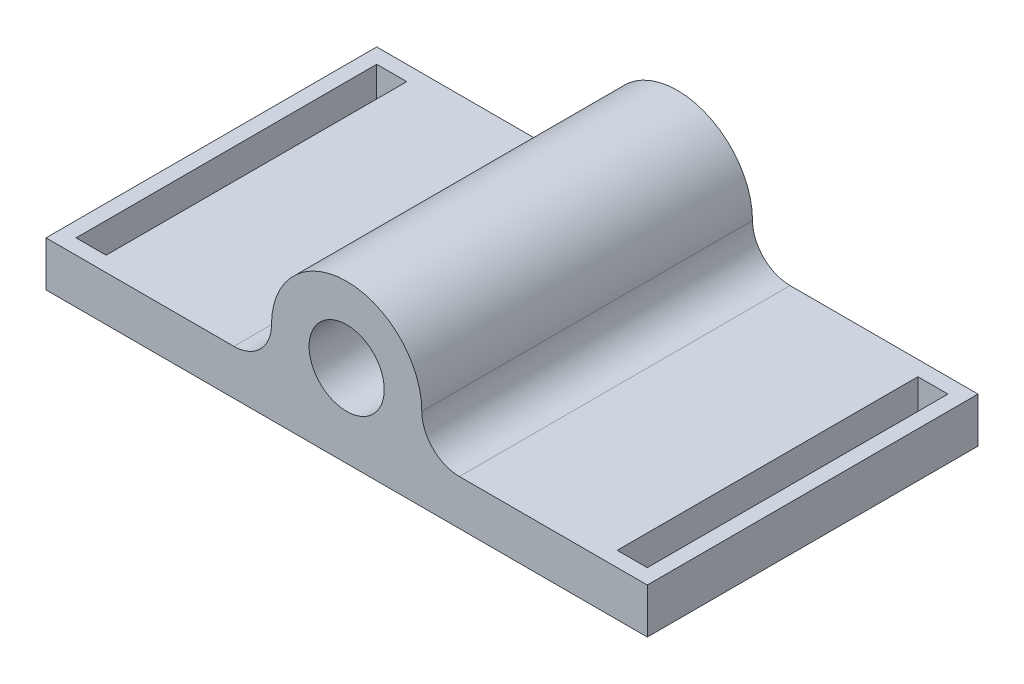
ISO-10303-21;
HEADER;
FILE_DESCRIPTION(('STEP AP214'),'2;1');
FILE_NAME('part.step','',(''),(''),'','','');
FILE_SCHEMA(('AUTOMOTIVE_DESIGN { 1 0 10303 214 1 1 1 1 }'));
ENDSEC;
DATA;
#1=APPLICATION_CONTEXT('core data for automotive mechanical design processes');
#2=APPLICATION_PROTOCOL_DEFINITION('international standard','automotive_design',2000,#1);
#3=PRODUCT_CONTEXT('',#1,'mechanical');
#4=PRODUCT('Part','Part','',(#3));
#5=PRODUCT_RELATED_PRODUCT_CATEGORY('part','',(#4));
#6=PRODUCT_DEFINITION_FORMATION('','',#4);
#7=PRODUCT_DEFINITION_CONTEXT('part definition',#1,'design');
#8=PRODUCT_DEFINITION('design','',#6,#7);
#9=PRODUCT_DEFINITION_SHAPE('','',#8);
#10=(LENGTH_UNIT() NAMED_UNIT(*) SI_UNIT(.MILLI.,.METRE.));
#11=(NAMED_UNIT(*) PLANE_ANGLE_UNIT() SI_UNIT($,.RADIAN.));
#12=(NAMED_UNIT(*) SI_UNIT($,.STERADIAN.) SOLID_ANGLE_UNIT());
#13=UNCERTAINTY_MEASURE_WITH_UNIT(LENGTH_MEASURE(1.E-05),#10,'distance_accuracy_value','');
#14=(GEOMETRIC_REPRESENTATION_CONTEXT(3) GLOBAL_UNCERTAINTY_ASSIGNED_CONTEXT((#13)) GLOBAL_UNIT_ASSIGNED_CONTEXT((#10,
#11,#12)) REPRESENTATION_CONTEXT('',''));
#15=CARTESIAN_POINT('',(0.,0.,0.));
#16=DIRECTION('',(0.,0.,1.));
#17=DIRECTION('',(1.,0.,0.));
#18=AXIS2_PLACEMENT_3D('',#15,#16,#17);
#19=CARTESIAN_POINT('',(-15.,10.1307131936962,22.));
#20=DIRECTION('',(0.,0.,1.));
#21=DIRECTION('',(1.,0.,0.));
#22=AXIS2_PLACEMENT_3D('',#19,#20,#21);
#23=PLANE('',#22);
#24=DIRECTION('',(0.,-1.,0.));
#25=VECTOR('',#24,1.);
#26=CARTESIAN_POINT('',(-27.5,4.63071319369619,22.));
#27=LINE('',#26,#25);
#28=CARTESIAN_POINT('',(-27.5,7.63071319369619,22.));
#29=VERTEX_POINT('',#28);
#30=CARTESIAN_POINT('',(-27.5,4.63071319369619,22.));
#31=VERTEX_POINT('',#30);
#32=EDGE_CURVE('E258',#29,#31,#27,.T.);
#33=ORIENTED_EDGE('',*,*,#32,.T.);
#34=DIRECTION('',(1.,0.,0.));
#35=VECTOR('',#34,1.);
#36=CARTESIAN_POINT('',(-27.5,4.63071319369619,22.));
#37=LINE('',#36,#35);
#38=CARTESIAN_POINT('',(12.5,4.63071319369619,22.));
#39=VERTEX_POINT('',#38);
#40=EDGE_CURVE('E262',#31,#39,#37,.T.);
#41=ORIENTED_EDGE('',*,*,#40,.T.);
#42=DIRECTION('',(0.,1.,0.));
#43=VECTOR('',#42,1.);
#44=CARTESIAN_POINT('',(12.5,4.63071319369619,22.));
#45=LINE('',#44,#43);
#46=CARTESIAN_POINT('',(12.5,7.63071319369619,22.));
#47=VERTEX_POINT('',#46);
#48=EDGE_CURVE('E266',#39,#47,#45,.T.);
#49=ORIENTED_EDGE('',*,*,#48,.T.);
#50=DIRECTION('',(-1.,0.,0.));
#51=VECTOR('',#50,1.);
#52=CARTESIAN_POINT('',(12.5,7.63071319369619,22.));
#53=LINE('',#52,#51);
#54=CARTESIAN_POINT('',(0.,7.63071319369619,22.));
#55=VERTEX_POINT('',#54);
#56=EDGE_CURVE('E269',#47,#55,#53,.T.);
#57=ORIENTED_EDGE('',*,*,#56,.T.);
#58=CARTESIAN_POINT('',(0.,10.1307131936962,22.));
#59=DIRECTION('',(0.,0.,-1.));
#60=DIRECTION('',(-1.,0.,0.));
#61=AXIS2_PLACEMENT_3D('',#58,#59,#60);
#62=CIRCLE('',#61,2.5);
#63=CARTESIAN_POINT('',(-2.5,10.1307131936962,22.));
#64=VERTEX_POINT('',#63);
#65=EDGE_CURVE('E272',#55,#64,#62,.T.);
#66=ORIENTED_EDGE('',*,*,#65,.T.);
#67=CARTESIAN_POINT('',(-7.5,10.1307131936962,22.));
#68=DIRECTION('',(0.,0.,1.));
#69=DIRECTION('',(1.,0.,0.));
#70=AXIS2_PLACEMENT_3D('',#67,#68,#69);
#71=CIRCLE('',#70,5.);
#72=CARTESIAN_POINT('',(-12.5,10.1307131936962,22.));
#73=VERTEX_POINT('',#72);
#74=EDGE_CURVE('E275',#64,#73,#71,.T.);
#75=ORIENTED_EDGE('',*,*,#74,.T.);
#76=CARTESIAN_POINT('',(-15.,10.1307131936962,22.));
#77=DIRECTION('',(0.,0.,-1.));
#78=DIRECTION('',(1.,0.,0.));
#79=AXIS2_PLACEMENT_3D('',#76,#77,#78);
#80=CIRCLE('',#79,2.5);
#81=CARTESIAN_POINT('',(-15.,7.63071319369619,22.));
#82=VERTEX_POINT('',#81);
#83=EDGE_CURVE('E278',#73,#82,#80,.T.);
#84=ORIENTED_EDGE('',*,*,#83,.T.);
#85=DIRECTION('',(-1.,0.,0.));
#86=VECTOR('',#85,1.);
#87=CARTESIAN_POINT('',(-27.5,7.63071319369619,22.));
#88=LINE('',#87,#86);
#89=EDGE_CURVE('E281',#82,#29,#88,.T.);
#90=ORIENTED_EDGE('',*,*,#89,.T.);
#91=EDGE_LOOP('',(#33,#41,#49,#57,#66,#75,#84,#90));
#92=FACE_BOUND('',#91,.T.);
#93=CARTESIAN_POINT('',(-7.5,10.1307131936962,22.));
#94=DIRECTION('',(0.,0.,1.));
#95=DIRECTION('',(1.,0.,0.));
#96=AXIS2_PLACEMENT_3D('',#93,#94,#95);
#97=CIRCLE('',#96,2.5);
#98=CARTESIAN_POINT('',(-5.,10.1307131936962,22.));
#99=VERTEX_POINT('',#98);
#100=EDGE_CURVE('E250',#99,#99,#97,.T.);
#101=ORIENTED_EDGE('',*,*,#100,.F.);
#102=EDGE_LOOP('',(#101));
#103=FACE_BOUND('',#102,.T.);
#104=ADVANCED_FACE('F42',(#92,#103),#23,.T.);
#105=CARTESIAN_POINT('',(-15.,10.1307131936962,0.));
#106=DIRECTION('',(0.,0.,1.));
#107=DIRECTION('',(1.,0.,0.));
#108=AXIS2_PLACEMENT_3D('',#105,#106,#107);
#109=PLANE('',#108);
#110=DIRECTION('',(0.,-1.,0.));
#111=VECTOR('',#110,1.);
#112=CARTESIAN_POINT('',(-27.5,4.63071319369619,0.));
#113=LINE('',#112,#111);
#114=CARTESIAN_POINT('',(-27.5,7.63071319369619,0.));
#115=VERTEX_POINT('',#114);
#116=CARTESIAN_POINT('',(-27.5,4.63071319369619,0.));
#117=VERTEX_POINT('',#116);
#118=EDGE_CURVE('E254',#115,#117,#113,.T.);
#119=ORIENTED_EDGE('',*,*,#118,.F.);
#120=DIRECTION('',(-1.,0.,0.));
#121=VECTOR('',#120,1.);
#122=CARTESIAN_POINT('',(-27.5,7.63071319369619,0.));
#123=LINE('',#122,#121);
#124=CARTESIAN_POINT('',(-15.,7.63071319369619,0.));
#125=VERTEX_POINT('',#124);
#126=EDGE_CURVE('E263',#125,#115,#123,.T.);
#127=ORIENTED_EDGE('',*,*,#126,.F.);
#128=CARTESIAN_POINT('',(-15.,10.1307131936962,0.));
#129=DIRECTION('',(0.,0.,-1.));
#130=DIRECTION('',(1.,0.,0.));
#131=AXIS2_PLACEMENT_3D('',#128,#129,#130);
#132=CIRCLE('',#131,2.5);
#133=CARTESIAN_POINT('',(-12.5,10.1307131936962,0.));
#134=VERTEX_POINT('',#133);
#135=EDGE_CURVE('E303',#134,#125,#132,.T.);
#136=ORIENTED_EDGE('',*,*,#135,.F.);
#137=CARTESIAN_POINT('',(-7.5,10.1307131936962,0.));
#138=DIRECTION('',(0.,0.,1.));
#139=DIRECTION('',(1.,0.,0.));
#140=AXIS2_PLACEMENT_3D('',#137,#138,#139);
#141=CIRCLE('',#140,5.);
#142=CARTESIAN_POINT('',(-2.5,10.1307131936962,0.));
#143=VERTEX_POINT('',#142);
#144=EDGE_CURVE('E300',#143,#134,#141,.T.);
#145=ORIENTED_EDGE('',*,*,#144,.F.);
#146=CARTESIAN_POINT('',(0.,10.1307131936962,0.));
#147=DIRECTION('',(0.,0.,-1.));
#148=DIRECTION('',(-1.,0.,0.));
#149=AXIS2_PLACEMENT_3D('',#146,#147,#148);
#150=CIRCLE('',#149,2.5);
#151=CARTESIAN_POINT('',(0.,7.63071319369619,0.));
#152=VERTEX_POINT('',#151);
#153=EDGE_CURVE('E297',#152,#143,#150,.T.);
#154=ORIENTED_EDGE('',*,*,#153,.F.);
#155=DIRECTION('',(-1.,0.,0.));
#156=VECTOR('',#155,1.);
#157=CARTESIAN_POINT('',(12.5,7.63071319369619,0.));
#158=LINE('',#157,#156);
#159=CARTESIAN_POINT('',(12.5,7.63071319369619,0.));
#160=VERTEX_POINT('',#159);
#161=EDGE_CURVE('E294',#160,#152,#158,.T.);
#162=ORIENTED_EDGE('',*,*,#161,.F.);
#163=DIRECTION('',(0.,1.,0.));
#164=VECTOR('',#163,1.);
#165=CARTESIAN_POINT('',(12.5,4.63071319369619,0.));
#166=LINE('',#165,#164);
#167=CARTESIAN_POINT('',(12.5,4.63071319369619,0.));
#168=VERTEX_POINT('',#167);
#169=EDGE_CURVE('E291',#168,#160,#166,.T.);
#170=ORIENTED_EDGE('',*,*,#169,.F.);
#171=DIRECTION('',(1.,0.,0.));
#172=VECTOR('',#171,1.);
#173=CARTESIAN_POINT('',(-27.5,4.63071319369619,0.));
#174=LINE('',#173,#172);
#175=EDGE_CURVE('E288',#117,#168,#174,.T.);
#176=ORIENTED_EDGE('',*,*,#175,.F.);
#177=EDGE_LOOP('',(#119,#127,#136,#145,#154,#162,#170,#176));
#178=FACE_BOUND('',#177,.T.);
#179=CARTESIAN_POINT('',(-7.5,10.1307131936962,0.));
#180=DIRECTION('',(0.,0.,1.));
#181=DIRECTION('',(1.,0.,0.));
#182=AXIS2_PLACEMENT_3D('',#179,#180,#181);
#183=CIRCLE('',#182,2.5);
#184=CARTESIAN_POINT('',(-5.,10.1307131936962,0.));
#185=VERTEX_POINT('',#184);
#186=EDGE_CURVE('E249',#185,#185,#183,.T.);
#187=ORIENTED_EDGE('',*,*,#186,.T.);
#188=EDGE_LOOP('',(#187));
#189=FACE_BOUND('',#188,.T.);
#190=ADVANCED_FACE('F342',(#178,#189),#109,.F.);
#191=CARTESIAN_POINT('',(-27.5,4.63071319369619,22.));
#192=DIRECTION('',(1.,0.,0.));
#193=DIRECTION('',(0.,0.,-1.));
#194=AXIS2_PLACEMENT_3D('',#191,#192,#193);
#195=PLANE('',#194);
#196=ORIENTED_EDGE('',*,*,#118,.T.);
#197=DIRECTION('',(0.,0.,-1.));
#198=VECTOR('',#197,1.);
#199=CARTESIAN_POINT('',(-27.5,4.63071319369619,22.));
#200=LINE('',#199,#198);
#201=EDGE_CURVE('E11',#31,#117,#200,.T.);
#202=ORIENTED_EDGE('',*,*,#201,.F.);
#203=ORIENTED_EDGE('',*,*,#32,.F.);
#204=DIRECTION('',(0.,0.,-1.));
#205=VECTOR('',#204,1.);
#206=CARTESIAN_POINT('',(-27.5,7.63071319369619,22.));
#207=LINE('',#206,#205);
#208=EDGE_CURVE('E284',#29,#115,#207,.T.);
#209=ORIENTED_EDGE('',*,*,#208,.T.);
#210=EDGE_LOOP('',(#196,#202,#203,#209));
#211=FACE_BOUND('',#210,.T.);
#212=ADVANCED_FACE('F44',(#211),#195,.F.);
#213=CARTESIAN_POINT('',(-27.5,4.63071319369619,22.));
#214=DIRECTION('',(0.,1.,0.));
#215=DIRECTION('',(0.,0.,1.));
#216=AXIS2_PLACEMENT_3D('',#213,#214,#215);
#217=PLANE('',#216);
#218=DIRECTION('',(-1.,0.,0.));
#219=VECTOR('',#218,1.);
#220=CARTESIAN_POINT('',(-27.5,4.63071319369619,1.));
#221=LINE('',#220,#219);
#222=CARTESIAN_POINT('',(-24.5,4.63071319369619,1.));
#223=VERTEX_POINT('',#222);
#224=CARTESIAN_POINT('',(-26.5,4.63071319369619,1.));
#225=VERTEX_POINT('',#224);
#226=EDGE_CURVE('E225',#223,#225,#221,.T.);
#227=ORIENTED_EDGE('',*,*,#226,.T.);
#228=DIRECTION('',(0.,0.,1.));
#229=VECTOR('',#228,1.);
#230=CARTESIAN_POINT('',(-26.5,4.63071319369619,22.));
#231=LINE('',#230,#229);
#232=CARTESIAN_POINT('',(-26.5,4.63071319369619,21.));
#233=VERTEX_POINT('',#232);
#234=EDGE_CURVE('E229',#225,#233,#231,.T.);
#235=ORIENTED_EDGE('',*,*,#234,.T.);
#236=DIRECTION('',(1.,0.,0.));
#237=VECTOR('',#236,1.);
#238=CARTESIAN_POINT('',(-27.5,4.63071319369619,21.));
#239=LINE('',#238,#237);
#240=CARTESIAN_POINT('',(-24.5,4.63071319369619,21.));
#241=VERTEX_POINT('',#240);
#242=EDGE_CURVE('E190',#233,#241,#239,.T.);
#243=ORIENTED_EDGE('',*,*,#242,.T.);
#244=DIRECTION('',(0.,0.,-1.));
#245=VECTOR('',#244,1.);
#246=CARTESIAN_POINT('',(-24.5,4.63071319369619,22.));
#247=LINE('',#246,#245);
#248=EDGE_CURVE('E161',#241,#223,#247,.T.);
#249=ORIENTED_EDGE('',*,*,#248,.T.);
#250=EDGE_LOOP('',(#227,#235,#243,#249));
#251=FACE_BOUND('',#250,.T.);
#252=DIRECTION('',(-1.,0.,0.));
#253=VECTOR('',#252,1.);
#254=CARTESIAN_POINT('',(-27.5,4.63071319369619,1.));
#255=LINE('',#254,#253);
#256=CARTESIAN_POINT('',(11.5,4.63071319369619,1.));
#257=VERTEX_POINT('',#256);
#258=CARTESIAN_POINT('',(9.50000000000001,4.63071319369619,1.));
#259=VERTEX_POINT('',#258);
#260=EDGE_CURVE('E241',#257,#259,#255,.T.);
#261=ORIENTED_EDGE('',*,*,#260,.T.);
#262=DIRECTION('',(0.,0.,1.));
#263=VECTOR('',#262,1.);
#264=CARTESIAN_POINT('',(9.50000000000001,4.63071319369619,22.));
#265=LINE('',#264,#263);
#266=CARTESIAN_POINT('',(9.50000000000001,4.63071319369619,21.));
#267=VERTEX_POINT('',#266);
#268=EDGE_CURVE('E245',#259,#267,#265,.T.);
#269=ORIENTED_EDGE('',*,*,#268,.T.);
#270=DIRECTION('',(1.,0.,0.));
#271=VECTOR('',#270,1.);
#272=CARTESIAN_POINT('',(-27.5,4.63071319369619,21.));
#273=LINE('',#272,#271);
#274=CARTESIAN_POINT('',(11.5,4.63071319369619,21.));
#275=VERTEX_POINT('',#274);
#276=EDGE_CURVE('E233',#267,#275,#273,.T.);
#277=ORIENTED_EDGE('',*,*,#276,.T.);
#278=DIRECTION('',(0.,0.,-1.));
#279=VECTOR('',#278,1.);
#280=CARTESIAN_POINT('',(11.5,4.63071319369619,22.));
#281=LINE('',#280,#279);
#282=EDGE_CURVE('E237',#275,#257,#281,.T.);
#283=ORIENTED_EDGE('',*,*,#282,.T.);
#284=EDGE_LOOP('',(#261,#269,#277,#283));
#285=FACE_BOUND('',#284,.T.);
#286=ORIENTED_EDGE('',*,*,#175,.T.);
#287=DIRECTION('',(0.,0.,-1.));
#288=VECTOR('',#287,1.);
#289=CARTESIAN_POINT('',(12.5,4.63071319369619,22.));
#290=LINE('',#289,#288);
#291=EDGE_CURVE('E51',#39,#168,#290,.T.);
#292=ORIENTED_EDGE('',*,*,#291,.F.);
#293=ORIENTED_EDGE('',*,*,#40,.F.);
#294=ORIENTED_EDGE('',*,*,#201,.T.);
#295=EDGE_LOOP('',(#286,#292,#293,#294));
#296=FACE_BOUND('',#295,.T.);
#297=ADVANCED_FACE('F360',(#251,#285,#296),#217,.F.);
#298=CARTESIAN_POINT('',(12.5,4.63071319369619,22.));
#299=DIRECTION('',(-1.,0.,0.));
#300=DIRECTION('',(0.,0.,1.));
#301=AXIS2_PLACEMENT_3D('',#298,#299,#300);
#302=PLANE('',#301);
#303=ORIENTED_EDGE('',*,*,#169,.T.);
#304=DIRECTION('',(0.,0.,-1.));
#305=VECTOR('',#304,1.);
#306=CARTESIAN_POINT('',(12.5,7.63071319369619,22.));
#307=LINE('',#306,#305);
#308=EDGE_CURVE('E327',#47,#160,#307,.T.);
#309=ORIENTED_EDGE('',*,*,#308,.F.);
#310=ORIENTED_EDGE('',*,*,#48,.F.);
#311=ORIENTED_EDGE('',*,*,#291,.T.);
#312=EDGE_LOOP('',(#303,#309,#310,#311));
#313=FACE_BOUND('',#312,.T.);
#314=ADVANCED_FACE('F336',(#313),#302,.F.);
#315=CARTESIAN_POINT('',(12.5,7.63071319369619,22.));
#316=DIRECTION('',(0.,-1.,0.));
#317=DIRECTION('',(0.,0.,-1.));
#318=AXIS2_PLACEMENT_3D('',#315,#316,#317);
#319=PLANE('',#318);
#320=DIRECTION('',(1.,0.,0.));
#321=VECTOR('',#320,1.);
#322=CARTESIAN_POINT('',(9.50000000000001,7.63071319369619,21.));
#323=LINE('',#322,#321);
#324=CARTESIAN_POINT('',(9.50000000000001,7.63071319369619,21.));
#325=VERTEX_POINT('',#324);
#326=CARTESIAN_POINT('',(11.5,7.63071319369619,21.));
#327=VERTEX_POINT('',#326);
#328=EDGE_CURVE('E215',#325,#327,#323,.T.);
#329=ORIENTED_EDGE('',*,*,#328,.F.);
#330=DIRECTION('',(0.,0.,1.));
#331=VECTOR('',#330,1.);
#332=CARTESIAN_POINT('',(9.5,7.63071319369619,1.));
#333=LINE('',#332,#331);
#334=CARTESIAN_POINT('',(9.5,7.63071319369619,1.));
#335=VERTEX_POINT('',#334);
#336=EDGE_CURVE('E218',#335,#325,#333,.T.);
#337=ORIENTED_EDGE('',*,*,#336,.F.);
#338=DIRECTION('',(-1.,0.,0.));
#339=VECTOR('',#338,1.);
#340=CARTESIAN_POINT('',(9.5,7.63071319369619,1.));
#341=LINE('',#340,#339);
#342=CARTESIAN_POINT('',(11.5,7.63071319369619,1.));
#343=VERTEX_POINT('',#342);
#344=EDGE_CURVE('E199',#343,#335,#341,.T.);
#345=ORIENTED_EDGE('',*,*,#344,.F.);
#346=DIRECTION('',(0.,0.,-1.));
#347=VECTOR('',#346,1.);
#348=CARTESIAN_POINT('',(11.5,7.63071319369619,1.));
#349=LINE('',#348,#347);
#350=EDGE_CURVE('E211',#327,#343,#349,.T.);
#351=ORIENTED_EDGE('',*,*,#350,.F.);
#352=EDGE_LOOP('',(#329,#337,#345,#351));
#353=FACE_BOUND('',#352,.T.);
#354=ORIENTED_EDGE('',*,*,#161,.T.);
#355=DIRECTION('',(0.,0.,-1.));
#356=VECTOR('',#355,1.);
#357=CARTESIAN_POINT('',(0.,7.63071319369619,22.));
#358=LINE('',#357,#356);
#359=EDGE_CURVE('E323',#55,#152,#358,.T.);
#360=ORIENTED_EDGE('',*,*,#359,.F.);
#361=ORIENTED_EDGE('',*,*,#56,.F.);
#362=ORIENTED_EDGE('',*,*,#308,.T.);
#363=EDGE_LOOP('',(#354,#360,#361,#362));
#364=FACE_BOUND('',#363,.T.);
#365=ADVANCED_FACE('F348',(#353,#364),#319,.F.);
#366=CARTESIAN_POINT('',(0.,10.1307131936962,22.));
#367=DIRECTION('',(0.,0.,-1.));
#368=DIRECTION('',(-1.,0.,0.));
#369=AXIS2_PLACEMENT_3D('',#366,#367,#368);
#370=CYLINDRICAL_SURFACE('',#369,2.5);
#371=ORIENTED_EDGE('',*,*,#153,.T.);
#372=DIRECTION('',(0.,0.,-1.));
#373=VECTOR('',#372,1.);
#374=CARTESIAN_POINT('',(-2.5,10.1307131936962,22.));
#375=LINE('',#374,#373);
#376=EDGE_CURVE('E319',#64,#143,#375,.T.);
#377=ORIENTED_EDGE('',*,*,#376,.F.);
#378=ORIENTED_EDGE('',*,*,#65,.F.);
#379=ORIENTED_EDGE('',*,*,#359,.T.);
#380=EDGE_LOOP('',(#371,#377,#378,#379));
#381=FACE_BOUND('',#380,.T.);
#382=ADVANCED_FACE('F352',(#381),#370,.F.);
#383=CARTESIAN_POINT('',(-7.5,10.1307131936962,22.));
#384=DIRECTION('',(0.,0.,-1.));
#385=DIRECTION('',(-1.,0.,0.));
#386=AXIS2_PLACEMENT_3D('',#383,#384,#385);
#387=CYLINDRICAL_SURFACE('',#386,5.);
#388=ORIENTED_EDGE('',*,*,#144,.T.);
#389=DIRECTION('',(0.,0.,-1.));
#390=VECTOR('',#389,1.);
#391=CARTESIAN_POINT('',(-12.5,10.1307131936962,22.));
#392=LINE('',#391,#390);
#393=EDGE_CURVE('E315',#73,#134,#392,.T.);
#394=ORIENTED_EDGE('',*,*,#393,.F.);
#395=ORIENTED_EDGE('',*,*,#74,.F.);
#396=ORIENTED_EDGE('',*,*,#376,.T.);
#397=EDGE_LOOP('',(#388,#394,#395,#396));
#398=FACE_BOUND('',#397,.T.);
#399=ADVANCED_FACE('F371',(#398),#387,.T.);
#400=CARTESIAN_POINT('',(-15.,10.1307131936962,22.));
#401=DIRECTION('',(0.,0.,-1.));
#402=DIRECTION('',(-1.,0.,0.));
#403=AXIS2_PLACEMENT_3D('',#400,#401,#402);
#404=CYLINDRICAL_SURFACE('',#403,2.5);
#405=ORIENTED_EDGE('',*,*,#135,.T.);
#406=DIRECTION('',(0.,0.,-1.));
#407=VECTOR('',#406,1.);
#408=CARTESIAN_POINT('',(-15.,7.63071319369619,22.));
#409=LINE('',#408,#407);
#410=EDGE_CURVE('E311',#82,#125,#409,.T.);
#411=ORIENTED_EDGE('',*,*,#410,.F.);
#412=ORIENTED_EDGE('',*,*,#83,.F.);
#413=ORIENTED_EDGE('',*,*,#393,.T.);
#414=EDGE_LOOP('',(#405,#411,#412,#413));
#415=FACE_BOUND('',#414,.T.);
#416=ADVANCED_FACE('F369',(#415),#404,.F.);
#417=CARTESIAN_POINT('',(-27.5,7.63071319369619,22.));
#418=DIRECTION('',(0.,-1.,0.));
#419=DIRECTION('',(1.,0.,0.));
#420=AXIS2_PLACEMENT_3D('',#417,#418,#419);
#421=PLANE('',#420);
#422=DIRECTION('',(1.,0.,0.));
#423=VECTOR('',#422,1.);
#424=CARTESIAN_POINT('',(-26.5,7.63071319369619,21.));
#425=LINE('',#424,#423);
#426=CARTESIAN_POINT('',(-26.5,7.63071319369619,21.));
#427=VERTEX_POINT('',#426);
#428=CARTESIAN_POINT('',(-24.5,7.63071319369619,21.));
#429=VERTEX_POINT('',#428);
#430=EDGE_CURVE('E169',#427,#429,#425,.T.);
#431=ORIENTED_EDGE('',*,*,#430,.F.);
#432=DIRECTION('',(0.,0.,1.));
#433=VECTOR('',#432,1.);
#434=CARTESIAN_POINT('',(-26.5,7.63071319369619,1.));
#435=LINE('',#434,#433);
#436=CARTESIAN_POINT('',(-26.5,7.63071319369619,1.));
#437=VERTEX_POINT('',#436);
#438=EDGE_CURVE('E175',#437,#427,#435,.T.);
#439=ORIENTED_EDGE('',*,*,#438,.F.);
#440=DIRECTION('',(-1.,0.,0.));
#441=VECTOR('',#440,1.);
#442=CARTESIAN_POINT('',(-26.5,7.63071319369619,1.));
#443=LINE('',#442,#441);
#444=CARTESIAN_POINT('',(-24.5,7.63071319369619,1.));
#445=VERTEX_POINT('',#444);
#446=EDGE_CURVE('E180',#445,#437,#443,.T.);
#447=ORIENTED_EDGE('',*,*,#446,.F.);
#448=DIRECTION('',(0.,0.,-1.));
#449=VECTOR('',#448,1.);
#450=CARTESIAN_POINT('',(-24.5,7.63071319369619,1.));
#451=LINE('',#450,#449);
#452=EDGE_CURVE('E158',#429,#445,#451,.T.);
#453=ORIENTED_EDGE('',*,*,#452,.F.);
#454=EDGE_LOOP('',(#431,#439,#447,#453));
#455=FACE_BOUND('',#454,.T.);
#456=ORIENTED_EDGE('',*,*,#126,.T.);
#457=ORIENTED_EDGE('',*,*,#208,.F.);
#458=ORIENTED_EDGE('',*,*,#89,.F.);
#459=ORIENTED_EDGE('',*,*,#410,.T.);
#460=EDGE_LOOP('',(#456,#457,#458,#459));
#461=FACE_BOUND('',#460,.T.);
#462=ADVANCED_FACE('F177',(#455,#461),#421,.F.);
#463=CARTESIAN_POINT('',(-7.5,10.1307131936962,22.));
#464=DIRECTION('',(0.,0.,-1.));
#465=DIRECTION('',(-1.,0.,0.));
#466=AXIS2_PLACEMENT_3D('',#463,#464,#465);
#467=CYLINDRICAL_SURFACE('',#466,2.5);
#468=ORIENTED_EDGE('',*,*,#100,.T.);
#469=EDGE_LOOP('',(#468));
#470=FACE_BOUND('',#469,.T.);
#471=ORIENTED_EDGE('',*,*,#186,.F.);
#472=EDGE_LOOP('',(#471));
#473=FACE_BOUND('',#472,.T.);
#474=ADVANCED_FACE('F387',(#470,#473),#467,.F.);
#475=CARTESIAN_POINT('',(-26.5,-7.36928680630381,1.));
#476=DIRECTION('',(-1.,0.,0.));
#477=DIRECTION('',(0.,-1.,0.));
#478=AXIS2_PLACEMENT_3D('',#475,#476,#477);
#479=PLANE('',#478);
#480=DIRECTION('',(0.,1.,0.));
#481=VECTOR('',#480,1.);
#482=CARTESIAN_POINT('',(-26.5,-7.36928680630381,1.));
#483=LINE('',#482,#481);
#484=EDGE_CURVE('E187',#225,#437,#483,.T.);
#485=ORIENTED_EDGE('',*,*,#484,.T.);
#486=ORIENTED_EDGE('',*,*,#438,.T.);
#487=DIRECTION('',(0.,1.,0.));
#488=VECTOR('',#487,1.);
#489=CARTESIAN_POINT('',(-26.5,-7.36928680630381,21.));
#490=LINE('',#489,#488);
#491=EDGE_CURVE('E165',#233,#427,#490,.T.);
#492=ORIENTED_EDGE('',*,*,#491,.F.);
#493=ORIENTED_EDGE('',*,*,#234,.F.);
#494=EDGE_LOOP('',(#485,#486,#492,#493));
#495=FACE_BOUND('',#494,.T.);
#496=ADVANCED_FACE('F396',(#495),#479,.F.);
#497=CARTESIAN_POINT('',(-26.5,-7.36928680630381,1.));
#498=DIRECTION('',(0.,0.,-1.));
#499=DIRECTION('',(-1.,0.,0.));
#500=AXIS2_PLACEMENT_3D('',#497,#498,#499);
#501=PLANE('',#500);
#502=DIRECTION('',(0.,1.,0.));
#503=VECTOR('',#502,1.);
#504=CARTESIAN_POINT('',(-24.5,-7.36928680630381,1.));
#505=LINE('',#504,#503);
#506=EDGE_CURVE('E164',#223,#445,#505,.T.);
#507=ORIENTED_EDGE('',*,*,#506,.T.);
#508=ORIENTED_EDGE('',*,*,#446,.T.);
#509=ORIENTED_EDGE('',*,*,#484,.F.);
#510=ORIENTED_EDGE('',*,*,#226,.F.);
#511=EDGE_LOOP('',(#507,#508,#509,#510));
#512=FACE_BOUND('',#511,.T.);
#513=ADVANCED_FACE('F401',(#512),#501,.F.);
#514=CARTESIAN_POINT('',(-24.5,-7.36928680630381,1.));
#515=DIRECTION('',(1.,0.,0.));
#516=DIRECTION('',(0.,0.,-1.));
#517=AXIS2_PLACEMENT_3D('',#514,#515,#516);
#518=PLANE('',#517);
#519=DIRECTION('',(0.,1.,0.));
#520=VECTOR('',#519,1.);
#521=CARTESIAN_POINT('',(-24.5,-7.36928680630381,21.));
#522=LINE('',#521,#520);
#523=EDGE_CURVE('E58',#241,#429,#522,.T.);
#524=ORIENTED_EDGE('',*,*,#523,.T.);
#525=ORIENTED_EDGE('',*,*,#452,.T.);
#526=ORIENTED_EDGE('',*,*,#506,.F.);
#527=ORIENTED_EDGE('',*,*,#248,.F.);
#528=EDGE_LOOP('',(#524,#525,#526,#527));
#529=FACE_BOUND('',#528,.T.);
#530=ADVANCED_FACE('F155',(#529),#518,.F.);
#531=CARTESIAN_POINT('',(-26.5,-7.36928680630381,21.));
#532=DIRECTION('',(0.,0.,1.));
#533=DIRECTION('',(1.,0.,0.));
#534=AXIS2_PLACEMENT_3D('',#531,#532,#533);
#535=PLANE('',#534);
#536=ORIENTED_EDGE('',*,*,#491,.T.);
#537=ORIENTED_EDGE('',*,*,#430,.T.);
#538=ORIENTED_EDGE('',*,*,#523,.F.);
#539=ORIENTED_EDGE('',*,*,#242,.F.);
#540=EDGE_LOOP('',(#536,#537,#538,#539));
#541=FACE_BOUND('',#540,.T.);
#542=ADVANCED_FACE('F170',(#541),#535,.F.);
#543=CARTESIAN_POINT('',(9.50000000000001,-7.3692868063038,1.));
#544=DIRECTION('',(-1.,0.,0.));
#545=DIRECTION('',(0.,0.,1.));
#546=AXIS2_PLACEMENT_3D('',#543,#544,#545);
#547=PLANE('',#546);
#548=DIRECTION('',(0.,1.,0.));
#549=VECTOR('',#548,1.);
#550=CARTESIAN_POINT('',(9.50000000000001,-7.3692868063038,1.));
#551=LINE('',#550,#549);
#552=EDGE_CURVE('E205',#259,#335,#551,.T.);
#553=ORIENTED_EDGE('',*,*,#552,.T.);
#554=ORIENTED_EDGE('',*,*,#336,.T.);
#555=DIRECTION('',(0.,1.,0.));
#556=VECTOR('',#555,1.);
#557=CARTESIAN_POINT('',(9.50000000000001,-7.3692868063038,21.));
#558=LINE('',#557,#556);
#559=EDGE_CURVE('E195',#267,#325,#558,.T.);
#560=ORIENTED_EDGE('',*,*,#559,.F.);
#561=ORIENTED_EDGE('',*,*,#268,.F.);
#562=EDGE_LOOP('',(#553,#554,#560,#561));
#563=FACE_BOUND('',#562,.T.);
#564=ADVANCED_FACE('F414',(#563),#547,.F.);
#565=CARTESIAN_POINT('',(9.50000000000001,-7.3692868063038,1.));
#566=DIRECTION('',(0.,0.,-1.));
#567=DIRECTION('',(-1.,0.,0.));
#568=AXIS2_PLACEMENT_3D('',#565,#566,#567);
#569=PLANE('',#568);
#570=DIRECTION('',(0.,1.,0.));
#571=VECTOR('',#570,1.);
#572=CARTESIAN_POINT('',(11.5,-7.3692868063038,1.));
#573=LINE('',#572,#571);
#574=EDGE_CURVE('E202',#257,#343,#573,.T.);
#575=ORIENTED_EDGE('',*,*,#574,.T.);
#576=ORIENTED_EDGE('',*,*,#344,.T.);
#577=ORIENTED_EDGE('',*,*,#552,.F.);
#578=ORIENTED_EDGE('',*,*,#260,.F.);
#579=EDGE_LOOP('',(#575,#576,#577,#578));
#580=FACE_BOUND('',#579,.T.);
#581=ADVANCED_FACE('F417',(#580),#569,.F.);
#582=CARTESIAN_POINT('',(11.5,-7.3692868063038,1.));
#583=DIRECTION('',(1.,0.,0.));
#584=DIRECTION('',(0.,0.,-1.));
#585=AXIS2_PLACEMENT_3D('',#582,#583,#584);
#586=PLANE('',#585);
#587=DIRECTION('',(0.,1.,0.));
#588=VECTOR('',#587,1.);
#589=CARTESIAN_POINT('',(11.5,-7.3692868063038,21.));
#590=LINE('',#589,#588);
#591=EDGE_CURVE('E66',#275,#327,#590,.T.);
#592=ORIENTED_EDGE('',*,*,#591,.T.);
#593=ORIENTED_EDGE('',*,*,#350,.T.);
#594=ORIENTED_EDGE('',*,*,#574,.F.);
#595=ORIENTED_EDGE('',*,*,#282,.F.);
#596=EDGE_LOOP('',(#592,#593,#594,#595));
#597=FACE_BOUND('',#596,.T.);
#598=ADVANCED_FACE('F422',(#597),#586,.F.);
#599=CARTESIAN_POINT('',(9.50000000000001,-7.3692868063038,21.));
#600=DIRECTION('',(0.,0.,1.));
#601=DIRECTION('',(1.,0.,0.));
#602=AXIS2_PLACEMENT_3D('',#599,#600,#601);
#603=PLANE('',#602);
#604=ORIENTED_EDGE('',*,*,#559,.T.);
#605=ORIENTED_EDGE('',*,*,#328,.T.);
#606=ORIENTED_EDGE('',*,*,#591,.F.);
#607=ORIENTED_EDGE('',*,*,#276,.F.);
#608=EDGE_LOOP('',(#604,#605,#606,#607));
#609=FACE_BOUND('',#608,.T.);
#610=ADVANCED_FACE('F419',(#609),#603,.F.);
#611=CLOSED_SHELL('',(#104,#190,#212,#297,#314,#365,#382,#399,#416,#462,#474,#496,#513,#530,
#542,#564,#581,#598,#610));
#612=MANIFOLD_SOLID_BREP('B2',#611);
#613=ADVANCED_BREP_SHAPE_REPRESENTATION('',(#18,#612),#14);
#614=SHAPE_DEFINITION_REPRESENTATION(#9,#613);
ENDSEC;
END-ISO-10303-21;
